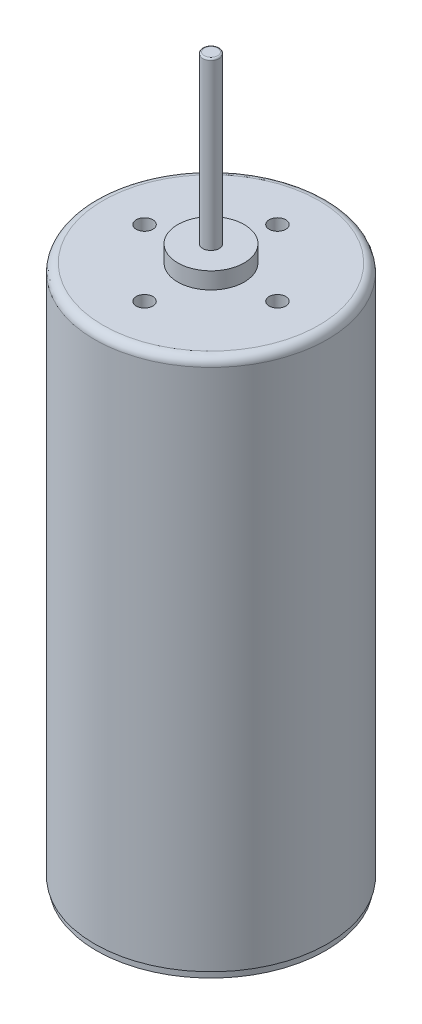
ISO-10303-21;
HEADER;
FILE_DESCRIPTION(('STEP AP214'),'2;1');
FILE_NAME('part.step','',(''),(''),'','','');
FILE_SCHEMA(('AUTOMOTIVE_DESIGN { 1 0 10303 214 1 1 1 1 }'));
ENDSEC;
DATA;
#1=APPLICATION_CONTEXT('core data for automotive mechanical design processes');
#2=APPLICATION_PROTOCOL_DEFINITION('international standard','automotive_design',2000,#1);
#3=PRODUCT_CONTEXT('',#1,'mechanical');
#4=PRODUCT('Part','Part','',(#3));
#5=PRODUCT_RELATED_PRODUCT_CATEGORY('part','',(#4));
#6=PRODUCT_DEFINITION_FORMATION('','',#4);
#7=PRODUCT_DEFINITION_CONTEXT('part definition',#1,'design');
#8=PRODUCT_DEFINITION('design','',#6,#7);
#9=PRODUCT_DEFINITION_SHAPE('','',#8);
#10=(LENGTH_UNIT() NAMED_UNIT(*) SI_UNIT(.MILLI.,.METRE.));
#11=(NAMED_UNIT(*) PLANE_ANGLE_UNIT() SI_UNIT($,.RADIAN.));
#12=(NAMED_UNIT(*) SI_UNIT($,.STERADIAN.) SOLID_ANGLE_UNIT());
#13=UNCERTAINTY_MEASURE_WITH_UNIT(LENGTH_MEASURE(1.E-05),#10,'distance_accuracy_value','');
#14=(GEOMETRIC_REPRESENTATION_CONTEXT(3) GLOBAL_UNCERTAINTY_ASSIGNED_CONTEXT((#13)) GLOBAL_UNIT_ASSIGNED_CONTEXT((#10,
#11,#12)) REPRESENTATION_CONTEXT('',''));
#15=CARTESIAN_POINT('',(0.,0.,0.));
#16=DIRECTION('',(0.,0.,1.));
#17=DIRECTION('',(1.,0.,0.));
#18=AXIS2_PLACEMENT_3D('',#15,#16,#17);
#19=CARTESIAN_POINT('',(0.,16.,0.));
#20=DIRECTION('',(0.,-1.,0.));
#21=DIRECTION('',(0.,0.,-1.));
#22=AXIS2_PLACEMENT_3D('',#19,#20,#21);
#23=CYLINDRICAL_SURFACE('',#22,3.5);
#24=CARTESIAN_POINT('',(0.,15.75,0.));
#25=DIRECTION('',(0.,1.,0.));
#26=DIRECTION('',(0.,0.,1.));
#27=AXIS2_PLACEMENT_3D('',#24,#25,#26);
#28=CIRCLE('',#27,3.5);
#29=CARTESIAN_POINT('',(0.,15.75,3.5));
#30=VERTEX_POINT('',#29);
#31=EDGE_CURVE('E55',#30,#30,#28,.F.);
#32=ORIENTED_EDGE('',*,*,#31,.T.);
#33=EDGE_LOOP('',(#32));
#34=FACE_BOUND('',#33,.T.);
#35=CARTESIAN_POINT('',(0.,0.,0.));
#36=DIRECTION('',(0.,1.,0.));
#37=DIRECTION('',(0.,0.,1.));
#38=AXIS2_PLACEMENT_3D('',#35,#36,#37);
#39=CIRCLE('',#38,3.5);
#40=CARTESIAN_POINT('',(0.,0.,3.5));
#41=VERTEX_POINT('',#40);
#42=EDGE_CURVE('E67',#41,#41,#39,.T.);
#43=ORIENTED_EDGE('',*,*,#42,.T.);
#44=EDGE_LOOP('',(#43));
#45=FACE_BOUND('',#44,.T.);
#46=ADVANCED_FACE('F42',(#34,#45),#23,.T.);
#47=CARTESIAN_POINT('',(0.,16.,0.));
#48=DIRECTION('',(0.,1.,0.));
#49=DIRECTION('',(0.,0.,1.));
#50=AXIS2_PLACEMENT_3D('',#47,#48,#49);
#51=PLANE('',#50);
#52=CARTESIAN_POINT('',(0.,16.,-2.));
#53=DIRECTION('',(0.,1.,0.));
#54=DIRECTION('',(0.,0.,1.));
#55=AXIS2_PLACEMENT_3D('',#52,#53,#54);
#56=CIRCLE('',#55,0.25);
#57=CARTESIAN_POINT('',(0.,16.,-1.75));
#58=VERTEX_POINT('',#57);
#59=EDGE_CURVE('E131',#58,#58,#56,.T.);
#60=ORIENTED_EDGE('',*,*,#59,.F.);
#61=EDGE_LOOP('',(#60));
#62=FACE_BOUND('',#61,.T.);
#63=CARTESIAN_POINT('',(2.00000000000006,16.,0.));
#64=DIRECTION('',(0.,1.,0.));
#65=DIRECTION('',(0.,0.,1.));
#66=AXIS2_PLACEMENT_3D('',#63,#64,#65);
#67=CIRCLE('',#66,0.250000000000044);
#68=CARTESIAN_POINT('',(2.00000000000006,16.,0.249999999999988));
#69=VERTEX_POINT('',#68);
#70=EDGE_CURVE('E127',#69,#69,#67,.T.);
#71=ORIENTED_EDGE('',*,*,#70,.F.);
#72=EDGE_LOOP('',(#71));
#73=FACE_BOUND('',#72,.T.);
#74=CARTESIAN_POINT('',(1.12952049642128E-13,16.,2.));
#75=DIRECTION('',(0.,1.,0.));
#76=DIRECTION('',(0.,0.,1.));
#77=AXIS2_PLACEMENT_3D('',#74,#75,#76);
#78=CIRCLE('',#77,0.250000000000122);
#79=CARTESIAN_POINT('',(1.12952049642128E-13,16.,2.25000000000012));
#80=VERTEX_POINT('',#79);
#81=EDGE_CURVE('E119',#80,#80,#78,.T.);
#82=ORIENTED_EDGE('',*,*,#81,.F.);
#83=EDGE_LOOP('',(#82));
#84=FACE_BOUND('',#83,.T.);
#85=CARTESIAN_POINT('',(-1.99999999999994,16.,0.));
#86=DIRECTION('',(0.,1.,0.));
#87=DIRECTION('',(0.,0.,1.));
#88=AXIS2_PLACEMENT_3D('',#85,#86,#87);
#89=CIRCLE('',#88,0.250000000000091);
#90=CARTESIAN_POINT('',(-1.99999999999994,16.,0.250000000000147));
#91=VERTEX_POINT('',#90);
#92=EDGE_CURVE('E111',#91,#91,#89,.T.);
#93=ORIENTED_EDGE('',*,*,#92,.F.);
#94=EDGE_LOOP('',(#93));
#95=FACE_BOUND('',#94,.T.);
#96=CARTESIAN_POINT('',(0.,16.,0.));
#97=DIRECTION('',(0.,1.,0.));
#98=DIRECTION('',(0.,0.,1.));
#99=AXIS2_PLACEMENT_3D('',#96,#97,#98);
#100=CIRCLE('',#99,3.25);
#101=CARTESIAN_POINT('',(0.,16.,3.25));
#102=VERTEX_POINT('',#101);
#103=EDGE_CURVE('E60',#102,#102,#100,.T.);
#104=ORIENTED_EDGE('',*,*,#103,.T.);
#105=EDGE_LOOP('',(#104));
#106=FACE_BOUND('',#105,.T.);
#107=CARTESIAN_POINT('',(0.,16.,0.));
#108=DIRECTION('',(0.,1.,0.));
#109=DIRECTION('',(0.,0.,1.));
#110=AXIS2_PLACEMENT_3D('',#107,#108,#109);
#111=CIRCLE('',#110,1.);
#112=CARTESIAN_POINT('',(0.,16.,1.));
#113=VERTEX_POINT('',#112);
#114=EDGE_CURVE('E76',#113,#113,#111,.T.);
#115=ORIENTED_EDGE('',*,*,#114,.F.);
#116=EDGE_LOOP('',(#115));
#117=FACE_BOUND('',#116,.T.);
#118=ADVANCED_FACE('F148',(#62,#73,#84,#95,#106,#117),#51,.T.);
#119=CARTESIAN_POINT('',(0.,0.,0.));
#120=DIRECTION('',(0.,1.,0.));
#121=DIRECTION('',(0.,0.,1.));
#122=AXIS2_PLACEMENT_3D('',#119,#120,#121);
#123=PLANE('',#122);
#124=CARTESIAN_POINT('',(0.,0.,0.));
#125=DIRECTION('',(0.,-1.,0.));
#126=DIRECTION('',(0.,0.,-1.));
#127=AXIS2_PLACEMENT_3D('',#124,#125,#126);
#128=CIRCLE('',#127,3.45);
#129=CARTESIAN_POINT('',(0.,0.,-3.45));
#130=VERTEX_POINT('',#129);
#131=EDGE_CURVE('E71',#130,#130,#128,.T.);
#132=ORIENTED_EDGE('',*,*,#131,.F.);
#133=EDGE_LOOP('',(#132));
#134=FACE_BOUND('',#133,.T.);
#135=ORIENTED_EDGE('',*,*,#42,.F.);
#136=EDGE_LOOP('',(#135));
#137=FACE_BOUND('',#136,.T.);
#138=ADVANCED_FACE('F151',(#134,#137),#123,.F.);
#139=CARTESIAN_POINT('',(0.,-0.2,0.));
#140=DIRECTION('',(0.,1.,0.));
#141=DIRECTION('',(0.,0.,1.));
#142=AXIS2_PLACEMENT_3D('',#139,#140,#141);
#143=CYLINDRICAL_SURFACE('',#142,3.45);
#144=CARTESIAN_POINT('',(0.,-0.2,0.));
#145=DIRECTION('',(0.,-1.,0.));
#146=DIRECTION('',(0.,0.,-1.));
#147=AXIS2_PLACEMENT_3D('',#144,#145,#146);
#148=CIRCLE('',#147,3.45);
#149=CARTESIAN_POINT('',(0.,-0.2,-3.45));
#150=VERTEX_POINT('',#149);
#151=EDGE_CURVE('E72',#150,#150,#148,.T.);
#152=ORIENTED_EDGE('',*,*,#151,.F.);
#153=EDGE_LOOP('',(#152));
#154=FACE_BOUND('',#153,.T.);
#155=ORIENTED_EDGE('',*,*,#131,.T.);
#156=EDGE_LOOP('',(#155));
#157=FACE_BOUND('',#156,.T.);
#158=ADVANCED_FACE('F284',(#154,#157),#143,.T.);
#159=CARTESIAN_POINT('',(0.,-0.2,0.));
#160=DIRECTION('',(0.,-1.,0.));
#161=DIRECTION('',(0.,0.,-1.));
#162=AXIS2_PLACEMENT_3D('',#159,#160,#161);
#163=PLANE('',#162);
#164=CARTESIAN_POINT('',(-2.5,-0.2,0.));
#165=DIRECTION('',(0.,-1.,0.));
#166=DIRECTION('',(0.,0.,-1.));
#167=AXIS2_PLACEMENT_3D('',#164,#165,#166);
#168=CIRCLE('',#167,0.375);
#169=CARTESIAN_POINT('',(-2.5,-0.2,-0.375));
#170=VERTEX_POINT('',#169);
#171=EDGE_CURVE('E90',#170,#170,#168,.T.);
#172=ORIENTED_EDGE('',*,*,#171,.F.);
#173=EDGE_LOOP('',(#172));
#174=FACE_BOUND('',#173,.T.);
#175=CARTESIAN_POINT('',(2.5,-0.2,0.));
#176=DIRECTION('',(0.,-1.,0.));
#177=DIRECTION('',(0.,0.,-1.));
#178=AXIS2_PLACEMENT_3D('',#175,#176,#177);
#179=CIRCLE('',#178,0.375);
#180=CARTESIAN_POINT('',(2.5,-0.2,-0.375));
#181=VERTEX_POINT('',#180);
#182=EDGE_CURVE('E85',#181,#181,#179,.T.);
#183=ORIENTED_EDGE('',*,*,#182,.F.);
#184=EDGE_LOOP('',(#183));
#185=FACE_BOUND('',#184,.T.);
#186=ORIENTED_EDGE('',*,*,#151,.T.);
#187=EDGE_LOOP('',(#186));
#188=FACE_BOUND('',#187,.T.);
#189=ADVANCED_FACE('F290',(#174,#185,#188),#163,.T.);
#190=CARTESIAN_POINT('',(2.5,0.3,0.));
#191=DIRECTION('',(0.,-1.,0.));
#192=DIRECTION('',(0.,0.,-1.));
#193=AXIS2_PLACEMENT_3D('',#190,#191,#192);
#194=CYLINDRICAL_SURFACE('',#193,0.375);
#195=CARTESIAN_POINT('',(2.5,0.3,0.));
#196=DIRECTION('',(0.,-1.,0.));
#197=DIRECTION('',(0.,0.,-1.));
#198=AXIS2_PLACEMENT_3D('',#195,#196,#197);
#199=CIRCLE('',#198,0.375);
#200=CARTESIAN_POINT('',(2.5,0.3,-0.375));
#201=VERTEX_POINT('',#200);
#202=EDGE_CURVE('E81',#201,#201,#199,.T.);
#203=ORIENTED_EDGE('',*,*,#202,.F.);
#204=EDGE_LOOP('',(#203));
#205=FACE_BOUND('',#204,.T.);
#206=ORIENTED_EDGE('',*,*,#182,.T.);
#207=EDGE_LOOP('',(#206));
#208=FACE_BOUND('',#207,.T.);
#209=ADVANCED_FACE('F298',(#205,#208),#194,.F.);
#210=CARTESIAN_POINT('',(2.5,0.3,0.));
#211=DIRECTION('',(0.,-1.,0.));
#212=DIRECTION('',(0.,0.,-1.));
#213=AXIS2_PLACEMENT_3D('',#210,#211,#212);
#214=PLANE('',#213);
#215=ORIENTED_EDGE('',*,*,#202,.T.);
#216=EDGE_LOOP('',(#215));
#217=FACE_BOUND('',#216,.T.);
#218=ADVANCED_FACE('F306',(#217),#214,.T.);
#219=CARTESIAN_POINT('',(-2.5,0.3,0.));
#220=DIRECTION('',(0.,-1.,0.));
#221=DIRECTION('',(0.,0.,-1.));
#222=AXIS2_PLACEMENT_3D('',#219,#220,#221);
#223=CYLINDRICAL_SURFACE('',#222,0.375);
#224=CARTESIAN_POINT('',(-2.5,0.3,0.));
#225=DIRECTION('',(0.,-1.,0.));
#226=DIRECTION('',(0.,0.,-1.));
#227=AXIS2_PLACEMENT_3D('',#224,#225,#226);
#228=CIRCLE('',#227,0.375);
#229=CARTESIAN_POINT('',(-2.5,0.3,-0.375));
#230=VERTEX_POINT('',#229);
#231=EDGE_CURVE('E80',#230,#230,#228,.T.);
#232=ORIENTED_EDGE('',*,*,#231,.F.);
#233=EDGE_LOOP('',(#232));
#234=FACE_BOUND('',#233,.T.);
#235=ORIENTED_EDGE('',*,*,#171,.T.);
#236=EDGE_LOOP('',(#235));
#237=FACE_BOUND('',#236,.T.);
#238=ADVANCED_FACE('F176',(#234,#237),#223,.F.);
#239=CARTESIAN_POINT('',(-2.5,0.3,0.));
#240=DIRECTION('',(0.,-1.,0.));
#241=DIRECTION('',(0.,0.,-1.));
#242=AXIS2_PLACEMENT_3D('',#239,#240,#241);
#243=PLANE('',#242);
#244=ORIENTED_EDGE('',*,*,#231,.T.);
#245=EDGE_LOOP('',(#244));
#246=FACE_BOUND('',#245,.T.);
#247=ADVANCED_FACE('F166',(#246),#243,.T.);
#248=CARTESIAN_POINT('',(0.,16.5,0.));
#249=DIRECTION('',(0.,-1.,0.));
#250=DIRECTION('',(0.,0.,-1.));
#251=AXIS2_PLACEMENT_3D('',#248,#249,#250);
#252=CYLINDRICAL_SURFACE('',#251,1.);
#253=CARTESIAN_POINT('',(0.,16.5,0.));
#254=DIRECTION('',(0.,1.,0.));
#255=DIRECTION('',(0.,0.,1.));
#256=AXIS2_PLACEMENT_3D('',#253,#254,#255);
#257=CIRCLE('',#256,1.);
#258=CARTESIAN_POINT('',(0.,16.5,1.));
#259=VERTEX_POINT('',#258);
#260=EDGE_CURVE('E86',#259,#259,#257,.T.);
#261=ORIENTED_EDGE('',*,*,#260,.F.);
#262=EDGE_LOOP('',(#261));
#263=FACE_BOUND('',#262,.T.);
#264=ORIENTED_EDGE('',*,*,#114,.T.);
#265=EDGE_LOOP('',(#264));
#266=FACE_BOUND('',#265,.T.);
#267=ADVANCED_FACE('F163',(#263,#266),#252,.T.);
#268=CARTESIAN_POINT('',(0.,16.5,0.));
#269=DIRECTION('',(0.,1.,0.));
#270=DIRECTION('',(0.,0.,1.));
#271=AXIS2_PLACEMENT_3D('',#268,#269,#270);
#272=PLANE('',#271);
#273=CARTESIAN_POINT('',(0.,16.5,0.));
#274=DIRECTION('',(0.,1.,0.));
#275=DIRECTION('',(0.,0.,1.));
#276=AXIS2_PLACEMENT_3D('',#273,#274,#275);
#277=CIRCLE('',#276,0.25);
#278=CARTESIAN_POINT('',(0.,16.5,0.25));
#279=VERTEX_POINT('',#278);
#280=EDGE_CURVE('E66',#279,#279,#277,.T.);
#281=ORIENTED_EDGE('',*,*,#280,.F.);
#282=EDGE_LOOP('',(#281));
#283=FACE_BOUND('',#282,.T.);
#284=ORIENTED_EDGE('',*,*,#260,.T.);
#285=EDGE_LOOP('',(#284));
#286=FACE_BOUND('',#285,.T.);
#287=ADVANCED_FACE('F165',(#283,#286),#272,.T.);
#288=CARTESIAN_POINT('',(0.,21.5,0.));
#289=DIRECTION('',(0.,-1.,0.));
#290=DIRECTION('',(0.,0.,-1.));
#291=AXIS2_PLACEMENT_3D('',#288,#289,#290);
#292=CYLINDRICAL_SURFACE('',#291,0.25);
#293=CARTESIAN_POINT('',(0.,21.45,0.));
#294=DIRECTION('',(0.,1.,0.));
#295=DIRECTION('',(0.,0.,1.));
#296=AXIS2_PLACEMENT_3D('',#293,#294,#295);
#297=CIRCLE('',#296,0.25);
#298=CARTESIAN_POINT('',(0.,21.45,0.25));
#299=VERTEX_POINT('',#298);
#300=EDGE_CURVE('E10',#299,#299,#297,.F.);
#301=ORIENTED_EDGE('',*,*,#300,.T.);
#302=EDGE_LOOP('',(#301));
#303=FACE_BOUND('',#302,.T.);
#304=ORIENTED_EDGE('',*,*,#280,.T.);
#305=EDGE_LOOP('',(#304));
#306=FACE_BOUND('',#305,.T.);
#307=ADVANCED_FACE('F173',(#303,#306),#292,.T.);
#308=CARTESIAN_POINT('',(0.,21.5,0.));
#309=DIRECTION('',(0.,1.,0.));
#310=DIRECTION('',(0.,0.,1.));
#311=AXIS2_PLACEMENT_3D('',#308,#309,#310);
#312=PLANE('',#311);
#313=CARTESIAN_POINT('',(0.,21.5,0.));
#314=DIRECTION('',(0.,1.,0.));
#315=DIRECTION('',(0.,0.,1.));
#316=AXIS2_PLACEMENT_3D('',#313,#314,#315);
#317=CIRCLE('',#316,0.2);
#318=CARTESIAN_POINT('',(0.,21.5,0.2));
#319=VERTEX_POINT('',#318);
#320=EDGE_CURVE('E50',#319,#319,#317,.T.);
#321=ORIENTED_EDGE('',*,*,#320,.T.);
#322=EDGE_LOOP('',(#321));
#323=FACE_BOUND('',#322,.T.);
#324=ADVANCED_FACE('F189',(#323),#312,.T.);
#325=CARTESIAN_POINT('',(0.,15.75,0.));
#326=DIRECTION('',(0.,1.,0.));
#327=DIRECTION('',(0.,0.,1.));
#328=AXIS2_PLACEMENT_3D('',#325,#326,#327);
#329=TOROIDAL_SURFACE('',#328,3.25,0.25);
#330=ORIENTED_EDGE('',*,*,#31,.F.);
#331=EDGE_LOOP('',(#330));
#332=FACE_BOUND('',#331,.T.);
#333=ORIENTED_EDGE('',*,*,#103,.F.);
#334=EDGE_LOOP('',(#333));
#335=FACE_BOUND('',#334,.T.);
#336=ADVANCED_FACE('F187',(#332,#335),#329,.T.);
#337=CARTESIAN_POINT('',(0.,21.45,0.));
#338=DIRECTION('',(0.,1.,0.));
#339=DIRECTION('',(0.,0.,1.));
#340=AXIS2_PLACEMENT_3D('',#337,#338,#339);
#341=TOROIDAL_SURFACE('',#340,0.2,0.05);
#342=ORIENTED_EDGE('',*,*,#300,.F.);
#343=EDGE_LOOP('',(#342));
#344=FACE_BOUND('',#343,.T.);
#345=ORIENTED_EDGE('',*,*,#320,.F.);
#346=EDGE_LOOP('',(#345));
#347=FACE_BOUND('',#346,.T.);
#348=ADVANCED_FACE('F44',(#344,#347),#341,.T.);
#349=CARTESIAN_POINT('',(-1.99999999999994,15.,0.));
#350=DIRECTION('',(0.,1.,0.));
#351=DIRECTION('',(0.,0.,1.));
#352=AXIS2_PLACEMENT_3D('',#349,#350,#351);
#353=CYLINDRICAL_SURFACE('',#352,0.250000000000091);
#354=CARTESIAN_POINT('',(-1.99999999999994,15.,0.));
#355=DIRECTION('',(0.,1.,0.));
#356=DIRECTION('',(0.,0.,1.));
#357=AXIS2_PLACEMENT_3D('',#354,#355,#356);
#358=CIRCLE('',#357,0.250000000000091);
#359=CARTESIAN_POINT('',(-1.99999999999994,15.,0.250000000000147));
#360=VERTEX_POINT('',#359);
#361=EDGE_CURVE('E107',#360,#360,#358,.T.);
#362=ORIENTED_EDGE('',*,*,#361,.F.);
#363=EDGE_LOOP('',(#362));
#364=FACE_BOUND('',#363,.T.);
#365=ORIENTED_EDGE('',*,*,#92,.T.);
#366=EDGE_LOOP('',(#365));
#367=FACE_BOUND('',#366,.T.);
#368=ADVANCED_FACE('F195',(#364,#367),#353,.F.);
#369=CARTESIAN_POINT('',(-1.99999999999994,15.,0.));
#370=DIRECTION('',(0.,1.,0.));
#371=DIRECTION('',(0.,0.,1.));
#372=AXIS2_PLACEMENT_3D('',#369,#370,#371);
#373=PLANE('',#372);
#374=ORIENTED_EDGE('',*,*,#361,.T.);
#375=EDGE_LOOP('',(#374));
#376=FACE_BOUND('',#375,.T.);
#377=ADVANCED_FACE('F205',(#376),#373,.T.);
#378=CARTESIAN_POINT('',(1.12952049642128E-13,15.,2.));
#379=DIRECTION('',(0.,1.,0.));
#380=DIRECTION('',(0.,0.,1.));
#381=AXIS2_PLACEMENT_3D('',#378,#379,#380);
#382=CYLINDRICAL_SURFACE('',#381,0.250000000000122);
#383=CARTESIAN_POINT('',(1.12952049642128E-13,15.,2.));
#384=DIRECTION('',(0.,1.,0.));
#385=DIRECTION('',(0.,0.,1.));
#386=AXIS2_PLACEMENT_3D('',#383,#384,#385);
#387=CIRCLE('',#386,0.250000000000122);
#388=CARTESIAN_POINT('',(1.12952049642128E-13,15.,2.25000000000012));
#389=VERTEX_POINT('',#388);
#390=EDGE_CURVE('E115',#389,#389,#387,.T.);
#391=ORIENTED_EDGE('',*,*,#390,.F.);
#392=EDGE_LOOP('',(#391));
#393=FACE_BOUND('',#392,.T.);
#394=ORIENTED_EDGE('',*,*,#81,.T.);
#395=EDGE_LOOP('',(#394));
#396=FACE_BOUND('',#395,.T.);
#397=ADVANCED_FACE('F208',(#393,#396),#382,.F.);
#398=CARTESIAN_POINT('',(1.12952049642128E-13,15.,2.));
#399=DIRECTION('',(0.,1.,0.));
#400=DIRECTION('',(0.,0.,1.));
#401=AXIS2_PLACEMENT_3D('',#398,#399,#400);
#402=PLANE('',#401);
#403=ORIENTED_EDGE('',*,*,#390,.T.);
#404=EDGE_LOOP('',(#403));
#405=FACE_BOUND('',#404,.T.);
#406=ADVANCED_FACE('F213',(#405),#402,.T.);
#407=CARTESIAN_POINT('',(2.00000000000006,15.,0.));
#408=DIRECTION('',(0.,1.,0.));
#409=DIRECTION('',(0.,0.,1.));
#410=AXIS2_PLACEMENT_3D('',#407,#408,#409);
#411=CYLINDRICAL_SURFACE('',#410,0.250000000000044);
#412=CARTESIAN_POINT('',(2.00000000000006,15.,0.));
#413=DIRECTION('',(0.,1.,0.));
#414=DIRECTION('',(0.,0.,1.));
#415=AXIS2_PLACEMENT_3D('',#412,#413,#414);
#416=CIRCLE('',#415,0.250000000000044);
#417=CARTESIAN_POINT('',(2.00000000000006,15.,0.249999999999988));
#418=VERTEX_POINT('',#417);
#419=EDGE_CURVE('E123',#418,#418,#416,.T.);
#420=ORIENTED_EDGE('',*,*,#419,.F.);
#421=EDGE_LOOP('',(#420));
#422=FACE_BOUND('',#421,.T.);
#423=ORIENTED_EDGE('',*,*,#70,.T.);
#424=EDGE_LOOP('',(#423));
#425=FACE_BOUND('',#424,.T.);
#426=ADVANCED_FACE('F216',(#422,#425),#411,.F.);
#427=CARTESIAN_POINT('',(2.00000000000006,15.,0.));
#428=DIRECTION('',(0.,1.,0.));
#429=DIRECTION('',(0.,0.,1.));
#430=AXIS2_PLACEMENT_3D('',#427,#428,#429);
#431=PLANE('',#430);
#432=ORIENTED_EDGE('',*,*,#419,.T.);
#433=EDGE_LOOP('',(#432));
#434=FACE_BOUND('',#433,.T.);
#435=ADVANCED_FACE('F144',(#434),#431,.T.);
#436=CARTESIAN_POINT('',(0.,15.,-2.));
#437=DIRECTION('',(0.,1.,0.));
#438=DIRECTION('',(0.,0.,1.));
#439=AXIS2_PLACEMENT_3D('',#436,#437,#438);
#440=CYLINDRICAL_SURFACE('',#439,0.25);
#441=CARTESIAN_POINT('',(0.,15.,-2.));
#442=DIRECTION('',(0.,1.,0.));
#443=DIRECTION('',(0.,0.,1.));
#444=AXIS2_PLACEMENT_3D('',#441,#442,#443);
#445=CIRCLE('',#444,0.25);
#446=CARTESIAN_POINT('',(0.,15.,-1.75));
#447=VERTEX_POINT('',#446);
#448=EDGE_CURVE('E103',#447,#447,#445,.T.);
#449=ORIENTED_EDGE('',*,*,#448,.F.);
#450=EDGE_LOOP('',(#449));
#451=FACE_BOUND('',#450,.T.);
#452=ORIENTED_EDGE('',*,*,#59,.T.);
#453=EDGE_LOOP('',(#452));
#454=FACE_BOUND('',#453,.T.);
#455=ADVANCED_FACE('F141',(#451,#454),#440,.F.);
#456=CARTESIAN_POINT('',(0.,15.,-2.));
#457=DIRECTION('',(0.,1.,0.));
#458=DIRECTION('',(0.,0.,1.));
#459=AXIS2_PLACEMENT_3D('',#456,#457,#458);
#460=PLANE('',#459);
#461=ORIENTED_EDGE('',*,*,#448,.T.);
#462=EDGE_LOOP('',(#461));
#463=FACE_BOUND('',#462,.T.);
#464=ADVANCED_FACE('F139',(#463),#460,.T.);
#465=CLOSED_SHELL('',(#46,#118,#138,#158,#189,#209,#218,#238,#247,#267,#287,#307,#324,#336,#348,
#368,#377,#397,#406,#426,#435,#455,#464));
#466=MANIFOLD_SOLID_BREP('B2',#465);
#467=ADVANCED_BREP_SHAPE_REPRESENTATION('',(#18,#466),#14);
#468=SHAPE_DEFINITION_REPRESENTATION(#9,#467);
ENDSEC;
END-ISO-10303-21;
